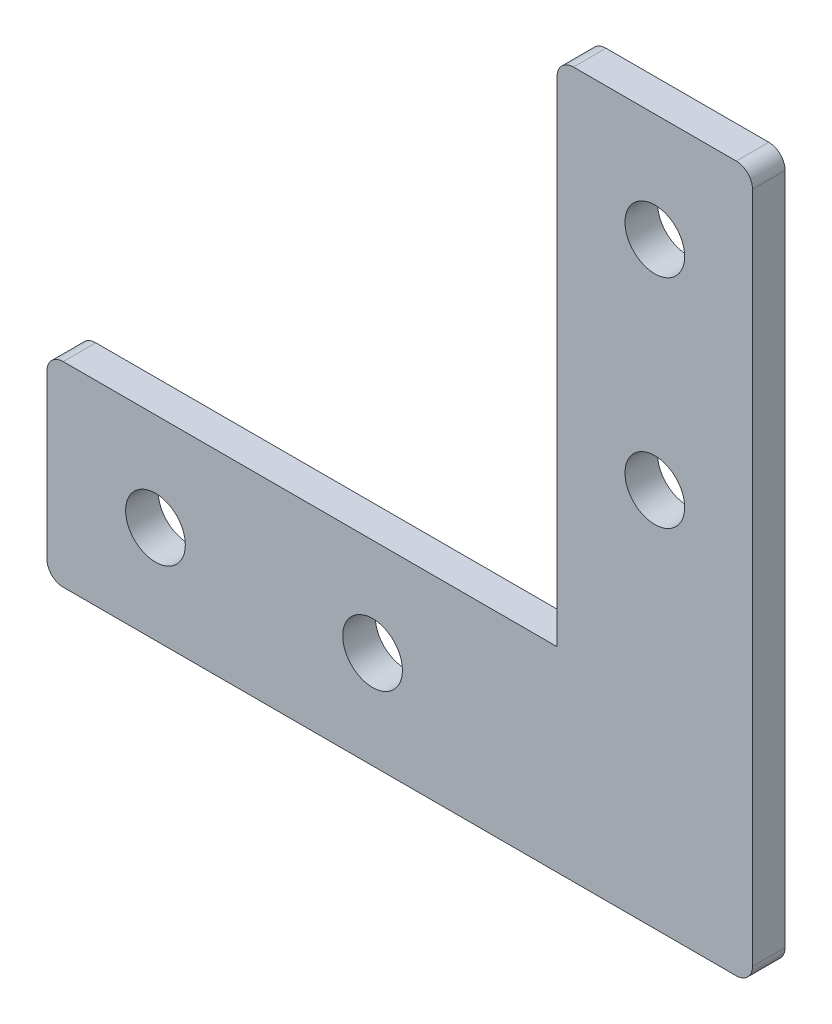
ISO-10303-21;
HEADER;
FILE_DESCRIPTION(('STEP AP214'),'2;1');
FILE_NAME('part.step','',(''),(''),'','','');
FILE_SCHEMA(('AUTOMOTIVE_DESIGN { 1 0 10303 214 1 1 1 1 }'));
ENDSEC;
DATA;
#1=APPLICATION_CONTEXT('core data for automotive mechanical design processes');
#2=APPLICATION_PROTOCOL_DEFINITION('international standard','automotive_design',2000,#1);
#3=PRODUCT_CONTEXT('',#1,'mechanical');
#4=PRODUCT('Part','Part','',(#3));
#5=PRODUCT_RELATED_PRODUCT_CATEGORY('part','',(#4));
#6=PRODUCT_DEFINITION_FORMATION('','',#4);
#7=PRODUCT_DEFINITION_CONTEXT('part definition',#1,'design');
#8=PRODUCT_DEFINITION('design','',#6,#7);
#9=PRODUCT_DEFINITION_SHAPE('','',#8);
#10=(LENGTH_UNIT() NAMED_UNIT(*) SI_UNIT(.MILLI.,.METRE.));
#11=(NAMED_UNIT(*) PLANE_ANGLE_UNIT() SI_UNIT($,.RADIAN.));
#12=(NAMED_UNIT(*) SI_UNIT($,.STERADIAN.) SOLID_ANGLE_UNIT());
#13=UNCERTAINTY_MEASURE_WITH_UNIT(LENGTH_MEASURE(1.E-05),#10,'distance_accuracy_value','');
#14=(GEOMETRIC_REPRESENTATION_CONTEXT(3) GLOBAL_UNCERTAINTY_ASSIGNED_CONTEXT((#13)) GLOBAL_UNIT_ASSIGNED_CONTEXT((#10,
#11,#12)) REPRESENTATION_CONTEXT('',''));
#15=CARTESIAN_POINT('',(0.,0.,0.));
#16=DIRECTION('',(0.,0.,1.));
#17=DIRECTION('',(1.,0.,0.));
#18=AXIS2_PLACEMENT_3D('',#15,#16,#17);
#19=CARTESIAN_POINT('',(1.5,16.5,0.));
#20=DIRECTION('',(0.,0.,1.));
#21=DIRECTION('',(1.,0.,0.));
#22=AXIS2_PLACEMENT_3D('',#19,#20,#21);
#23=PLANE('',#22);
#24=CARTESIAN_POINT('',(10.,9.,0.));
#25=DIRECTION('',(0.,0.,1.));
#26=DIRECTION('',(1.,0.,0.));
#27=AXIS2_PLACEMENT_3D('',#24,#25,#26);
#28=CIRCLE('',#27,2.75);
#29=CARTESIAN_POINT('',(12.75,9.,0.));
#30=VERTEX_POINT('',#29);
#31=EDGE_CURVE('E155',#30,#30,#28,.T.);
#32=ORIENTED_EDGE('',*,*,#31,.F.);
#33=EDGE_LOOP('',(#32));
#34=FACE_BOUND('',#33,.T.);
#35=CARTESIAN_POINT('',(30.,9.,0.));
#36=DIRECTION('',(0.,0.,1.));
#37=DIRECTION('',(1.,0.,0.));
#38=AXIS2_PLACEMENT_3D('',#35,#36,#37);
#39=CIRCLE('',#38,2.75);
#40=CARTESIAN_POINT('',(32.75,9.,0.));
#41=VERTEX_POINT('',#40);
#42=EDGE_CURVE('E167',#41,#41,#39,.T.);
#43=ORIENTED_EDGE('',*,*,#42,.F.);
#44=EDGE_LOOP('',(#43));
#45=FACE_BOUND('',#44,.T.);
#46=CARTESIAN_POINT('',(56.,35.,0.));
#47=DIRECTION('',(0.,0.,1.));
#48=DIRECTION('',(1.,0.,0.));
#49=AXIS2_PLACEMENT_3D('',#46,#47,#48);
#50=CIRCLE('',#49,2.75);
#51=CARTESIAN_POINT('',(58.75,35.,0.));
#52=VERTEX_POINT('',#51);
#53=EDGE_CURVE('E181',#52,#52,#50,.T.);
#54=ORIENTED_EDGE('',*,*,#53,.F.);
#55=EDGE_LOOP('',(#54));
#56=FACE_BOUND('',#55,.T.);
#57=CARTESIAN_POINT('',(56.,55.,0.));
#58=DIRECTION('',(0.,0.,1.));
#59=DIRECTION('',(1.,0.,0.));
#60=AXIS2_PLACEMENT_3D('',#57,#58,#59);
#61=CIRCLE('',#60,2.75);
#62=CARTESIAN_POINT('',(58.75,55.,0.));
#63=VERTEX_POINT('',#62);
#64=EDGE_CURVE('E198',#63,#63,#61,.T.);
#65=ORIENTED_EDGE('',*,*,#64,.F.);
#66=EDGE_LOOP('',(#65));
#67=FACE_BOUND('',#66,.T.);
#68=CARTESIAN_POINT('',(1.5,16.5,0.));
#69=DIRECTION('',(0.,0.,1.));
#70=DIRECTION('',(1.,0.,0.));
#71=AXIS2_PLACEMENT_3D('',#68,#69,#70);
#72=CIRCLE('',#71,1.5);
#73=CARTESIAN_POINT('',(1.5,18.,0.));
#74=VERTEX_POINT('',#73);
#75=CARTESIAN_POINT('',(0.,16.5,0.));
#76=VERTEX_POINT('',#75);
#77=EDGE_CURVE('E131',#74,#76,#72,.T.);
#78=ORIENTED_EDGE('',*,*,#77,.T.);
#79=DIRECTION('',(0.,-1.,0.));
#80=VECTOR('',#79,1.);
#81=CARTESIAN_POINT('',(0.,16.5,0.));
#82=LINE('',#81,#80);
#83=CARTESIAN_POINT('',(0.,1.5,0.));
#84=VERTEX_POINT('',#83);
#85=EDGE_CURVE('E27',#76,#84,#82,.T.);
#86=ORIENTED_EDGE('',*,*,#85,.T.);
#87=CARTESIAN_POINT('',(1.5,1.5,0.));
#88=DIRECTION('',(0.,0.,1.));
#89=DIRECTION('',(1.,0.,0.));
#90=AXIS2_PLACEMENT_3D('',#87,#88,#89);
#91=CIRCLE('',#90,1.5);
#92=CARTESIAN_POINT('',(1.5,0.,0.));
#93=VERTEX_POINT('',#92);
#94=EDGE_CURVE('E306',#84,#93,#91,.T.);
#95=ORIENTED_EDGE('',*,*,#94,.T.);
#96=DIRECTION('',(1.,0.,0.));
#97=VECTOR('',#96,1.);
#98=CARTESIAN_POINT('',(1.5,0.,0.));
#99=LINE('',#98,#97);
#100=CARTESIAN_POINT('',(63.5,0.,0.));
#101=VERTEX_POINT('',#100);
#102=EDGE_CURVE('E217',#93,#101,#99,.T.);
#103=ORIENTED_EDGE('',*,*,#102,.T.);
#104=CARTESIAN_POINT('',(63.5,1.5,0.));
#105=DIRECTION('',(0.,0.,1.));
#106=DIRECTION('',(1.,0.,0.));
#107=AXIS2_PLACEMENT_3D('',#104,#105,#106);
#108=CIRCLE('',#107,1.5);
#109=CARTESIAN_POINT('',(65.,1.5,0.));
#110=VERTEX_POINT('',#109);
#111=EDGE_CURVE('E246',#101,#110,#108,.T.);
#112=ORIENTED_EDGE('',*,*,#111,.T.);
#113=DIRECTION('',(0.,1.,0.));
#114=VECTOR('',#113,1.);
#115=CARTESIAN_POINT('',(65.,1.5,0.));
#116=LINE('',#115,#114);
#117=CARTESIAN_POINT('',(65.,63.5,0.));
#118=VERTEX_POINT('',#117);
#119=EDGE_CURVE('E231',#110,#118,#116,.T.);
#120=ORIENTED_EDGE('',*,*,#119,.T.);
#121=CARTESIAN_POINT('',(63.5,63.5,0.));
#122=DIRECTION('',(0.,0.,1.));
#123=DIRECTION('',(1.,0.,0.));
#124=AXIS2_PLACEMENT_3D('',#121,#122,#123);
#125=CIRCLE('',#124,1.5);
#126=CARTESIAN_POINT('',(63.5,65.,0.));
#127=VERTEX_POINT('',#126);
#128=EDGE_CURVE('E257',#118,#127,#125,.T.);
#129=ORIENTED_EDGE('',*,*,#128,.T.);
#130=DIRECTION('',(-1.,0.,0.));
#131=VECTOR('',#130,1.);
#132=CARTESIAN_POINT('',(63.5,65.,0.));
#133=LINE('',#132,#131);
#134=CARTESIAN_POINT('',(48.5,65.,0.));
#135=VERTEX_POINT('',#134);
#136=EDGE_CURVE('E264',#127,#135,#133,.T.);
#137=ORIENTED_EDGE('',*,*,#136,.T.);
#138=CARTESIAN_POINT('',(48.5,63.5,0.));
#139=DIRECTION('',(0.,0.,1.));
#140=DIRECTION('',(-1.,0.,0.));
#141=AXIS2_PLACEMENT_3D('',#138,#139,#140);
#142=CIRCLE('',#141,1.5);
#143=CARTESIAN_POINT('',(47.,63.5,0.));
#144=VERTEX_POINT('',#143);
#145=EDGE_CURVE('E297',#135,#144,#142,.T.);
#146=ORIENTED_EDGE('',*,*,#145,.T.);
#147=DIRECTION('',(0.,-1.,0.));
#148=VECTOR('',#147,1.);
#149=CARTESIAN_POINT('',(47.,63.5,0.));
#150=LINE('',#149,#148);
#151=CARTESIAN_POINT('',(47.,18.,0.));
#152=VERTEX_POINT('',#151);
#153=EDGE_CURVE('E133',#144,#152,#150,.T.);
#154=ORIENTED_EDGE('',*,*,#153,.T.);
#155=DIRECTION('',(-1.,0.,0.));
#156=VECTOR('',#155,1.);
#157=CARTESIAN_POINT('',(47.,18.,0.));
#158=LINE('',#157,#156);
#159=EDGE_CURVE('E128',#152,#74,#158,.T.);
#160=ORIENTED_EDGE('',*,*,#159,.T.);
#161=EDGE_LOOP('',(#78,#86,#95,#103,#112,#120,#129,#137,#146,#154,#160));
#162=FACE_BOUND('',#161,.T.);
#163=ADVANCED_FACE('F19',(#34,#45,#56,#67,#162),#23,.T.);
#164=CARTESIAN_POINT('',(1.5,16.5,-3.));
#165=DIRECTION('',(0.,0.,1.));
#166=DIRECTION('',(1.,0.,0.));
#167=AXIS2_PLACEMENT_3D('',#164,#165,#166);
#168=PLANE('',#167);
#169=CARTESIAN_POINT('',(10.,9.,-3.));
#170=DIRECTION('',(0.,0.,1.));
#171=DIRECTION('',(1.,0.,0.));
#172=AXIS2_PLACEMENT_3D('',#169,#170,#171);
#173=CIRCLE('',#172,2.75);
#174=CARTESIAN_POINT('',(12.75,9.,-3.));
#175=VERTEX_POINT('',#174);
#176=EDGE_CURVE('E163',#175,#175,#173,.T.);
#177=ORIENTED_EDGE('',*,*,#176,.T.);
#178=EDGE_LOOP('',(#177));
#179=FACE_BOUND('',#178,.T.);
#180=CARTESIAN_POINT('',(30.,9.,-3.));
#181=DIRECTION('',(0.,0.,1.));
#182=DIRECTION('',(1.,0.,0.));
#183=AXIS2_PLACEMENT_3D('',#180,#181,#182);
#184=CIRCLE('',#183,2.75);
#185=CARTESIAN_POINT('',(32.75,9.,-3.));
#186=VERTEX_POINT('',#185);
#187=EDGE_CURVE('E176',#186,#186,#184,.T.);
#188=ORIENTED_EDGE('',*,*,#187,.T.);
#189=EDGE_LOOP('',(#188));
#190=FACE_BOUND('',#189,.T.);
#191=CARTESIAN_POINT('',(56.,35.,-3.));
#192=DIRECTION('',(0.,0.,1.));
#193=DIRECTION('',(1.,0.,0.));
#194=AXIS2_PLACEMENT_3D('',#191,#192,#193);
#195=CIRCLE('',#194,2.75);
#196=CARTESIAN_POINT('',(58.75,35.,-3.));
#197=VERTEX_POINT('',#196);
#198=EDGE_CURVE('E193',#197,#197,#195,.T.);
#199=ORIENTED_EDGE('',*,*,#198,.T.);
#200=EDGE_LOOP('',(#199));
#201=FACE_BOUND('',#200,.T.);
#202=CARTESIAN_POINT('',(56.,55.,-3.));
#203=DIRECTION('',(0.,0.,1.));
#204=DIRECTION('',(1.,0.,0.));
#205=AXIS2_PLACEMENT_3D('',#202,#203,#204);
#206=CIRCLE('',#205,2.75);
#207=CARTESIAN_POINT('',(58.75,55.,-3.));
#208=VERTEX_POINT('',#207);
#209=EDGE_CURVE('E344',#208,#208,#206,.T.);
#210=ORIENTED_EDGE('',*,*,#209,.T.);
#211=EDGE_LOOP('',(#210));
#212=FACE_BOUND('',#211,.T.);
#213=CARTESIAN_POINT('',(1.5,16.5,-3.));
#214=DIRECTION('',(0.,0.,1.));
#215=DIRECTION('',(1.,0.,0.));
#216=AXIS2_PLACEMENT_3D('',#213,#214,#215);
#217=CIRCLE('',#216,1.5);
#218=CARTESIAN_POINT('',(1.5,18.,-3.));
#219=VERTEX_POINT('',#218);
#220=CARTESIAN_POINT('',(0.,16.5,-3.));
#221=VERTEX_POINT('',#220);
#222=EDGE_CURVE('E150',#219,#221,#217,.T.);
#223=ORIENTED_EDGE('',*,*,#222,.F.);
#224=DIRECTION('',(-1.,0.,0.));
#225=VECTOR('',#224,1.);
#226=CARTESIAN_POINT('',(47.,18.,-3.));
#227=LINE('',#226,#225);
#228=CARTESIAN_POINT('',(47.,18.,-3.));
#229=VERTEX_POINT('',#228);
#230=EDGE_CURVE('E145',#229,#219,#227,.T.);
#231=ORIENTED_EDGE('',*,*,#230,.F.);
#232=DIRECTION('',(0.,-1.,0.));
#233=VECTOR('',#232,1.);
#234=CARTESIAN_POINT('',(47.,63.5,-3.));
#235=LINE('',#234,#233);
#236=CARTESIAN_POINT('',(47.,63.5,-3.));
#237=VERTEX_POINT('',#236);
#238=EDGE_CURVE('E291',#237,#229,#235,.T.);
#239=ORIENTED_EDGE('',*,*,#238,.F.);
#240=CARTESIAN_POINT('',(48.5,63.5,-3.));
#241=DIRECTION('',(0.,0.,1.));
#242=DIRECTION('',(-1.,0.,0.));
#243=AXIS2_PLACEMENT_3D('',#240,#241,#242);
#244=CIRCLE('',#243,1.5);
#245=CARTESIAN_POINT('',(48.5,65.,-3.));
#246=VERTEX_POINT('',#245);
#247=EDGE_CURVE('E262',#246,#237,#244,.T.);
#248=ORIENTED_EDGE('',*,*,#247,.F.);
#249=DIRECTION('',(-1.,0.,0.));
#250=VECTOR('',#249,1.);
#251=CARTESIAN_POINT('',(63.5,65.,-3.));
#252=LINE('',#251,#250);
#253=CARTESIAN_POINT('',(63.5,65.,-3.));
#254=VERTEX_POINT('',#253);
#255=EDGE_CURVE('E261',#254,#246,#252,.T.);
#256=ORIENTED_EDGE('',*,*,#255,.F.);
#257=CARTESIAN_POINT('',(63.5,63.5,-3.));
#258=DIRECTION('',(0.,0.,1.));
#259=DIRECTION('',(1.,0.,0.));
#260=AXIS2_PLACEMENT_3D('',#257,#258,#259);
#261=CIRCLE('',#260,1.5);
#262=CARTESIAN_POINT('',(65.,63.5,-3.));
#263=VERTEX_POINT('',#262);
#264=EDGE_CURVE('E237',#263,#254,#261,.T.);
#265=ORIENTED_EDGE('',*,*,#264,.F.);
#266=DIRECTION('',(0.,1.,0.));
#267=VECTOR('',#266,1.);
#268=CARTESIAN_POINT('',(65.,1.5,-3.));
#269=LINE('',#268,#267);
#270=CARTESIAN_POINT('',(65.,1.5,-3.));
#271=VERTEX_POINT('',#270);
#272=EDGE_CURVE('E243',#271,#263,#269,.T.);
#273=ORIENTED_EDGE('',*,*,#272,.F.);
#274=CARTESIAN_POINT('',(63.5,1.5,-3.));
#275=DIRECTION('',(0.,0.,1.));
#276=DIRECTION('',(1.,0.,0.));
#277=AXIS2_PLACEMENT_3D('',#274,#275,#276);
#278=CIRCLE('',#277,1.5);
#279=CARTESIAN_POINT('',(63.5,0.,-3.));
#280=VERTEX_POINT('',#279);
#281=EDGE_CURVE('E222',#280,#271,#278,.T.);
#282=ORIENTED_EDGE('',*,*,#281,.F.);
#283=DIRECTION('',(1.,0.,0.));
#284=VECTOR('',#283,1.);
#285=CARTESIAN_POINT('',(1.5,0.,-3.));
#286=LINE('',#285,#284);
#287=CARTESIAN_POINT('',(1.5,0.,-3.));
#288=VERTEX_POINT('',#287);
#289=EDGE_CURVE('E414',#288,#280,#286,.T.);
#290=ORIENTED_EDGE('',*,*,#289,.F.);
#291=CARTESIAN_POINT('',(1.5,1.5,-3.));
#292=DIRECTION('',(0.,0.,1.));
#293=DIRECTION('',(1.,0.,0.));
#294=AXIS2_PLACEMENT_3D('',#291,#292,#293);
#295=CIRCLE('',#294,1.5);
#296=CARTESIAN_POINT('',(0.,1.5,-3.));
#297=VERTEX_POINT('',#296);
#298=EDGE_CURVE('E273',#297,#288,#295,.T.);
#299=ORIENTED_EDGE('',*,*,#298,.F.);
#300=DIRECTION('',(0.,-1.,0.));
#301=VECTOR('',#300,1.);
#302=CARTESIAN_POINT('',(0.,16.5,-3.));
#303=LINE('',#302,#301);
#304=EDGE_CURVE('E12',#221,#297,#303,.T.);
#305=ORIENTED_EDGE('',*,*,#304,.F.);
#306=EDGE_LOOP('',(#223,#231,#239,#248,#256,#265,#273,#282,#290,#299,#305));
#307=FACE_BOUND('',#306,.T.);
#308=ADVANCED_FACE('F290',(#179,#190,#201,#212,#307),#168,.F.);
#309=CARTESIAN_POINT('',(0.,16.5,-3.));
#310=DIRECTION('',(-1.,0.,0.));
#311=DIRECTION('',(0.,0.,1.));
#312=AXIS2_PLACEMENT_3D('',#309,#310,#311);
#313=PLANE('',#312);
#314=ORIENTED_EDGE('',*,*,#85,.F.);
#315=DIRECTION('',(0.,0.,1.));
#316=VECTOR('',#315,1.);
#317=CARTESIAN_POINT('',(0.,16.5,-3.));
#318=LINE('',#317,#316);
#319=EDGE_CURVE('E139',#221,#76,#318,.T.);
#320=ORIENTED_EDGE('',*,*,#319,.F.);
#321=ORIENTED_EDGE('',*,*,#304,.T.);
#322=DIRECTION('',(0.,0.,1.));
#323=VECTOR('',#322,1.);
#324=CARTESIAN_POINT('',(0.,1.5,-3.));
#325=LINE('',#324,#323);
#326=EDGE_CURVE('E304',#297,#84,#325,.T.);
#327=ORIENTED_EDGE('',*,*,#326,.T.);
#328=EDGE_LOOP('',(#314,#320,#321,#327));
#329=FACE_BOUND('',#328,.T.);
#330=ADVANCED_FACE('F330',(#329),#313,.T.);
#331=CARTESIAN_POINT('',(1.5,1.5,-3.));
#332=DIRECTION('',(0.,0.,1.));
#333=DIRECTION('',(1.,0.,0.));
#334=AXIS2_PLACEMENT_3D('',#331,#332,#333);
#335=CYLINDRICAL_SURFACE('',#334,1.5);
#336=ORIENTED_EDGE('',*,*,#94,.F.);
#337=ORIENTED_EDGE('',*,*,#326,.F.);
#338=ORIENTED_EDGE('',*,*,#298,.T.);
#339=DIRECTION('',(0.,0.,1.));
#340=VECTOR('',#339,1.);
#341=CARTESIAN_POINT('',(1.5,0.,-3.));
#342=LINE('',#341,#340);
#343=EDGE_CURVE('E221',#288,#93,#342,.T.);
#344=ORIENTED_EDGE('',*,*,#343,.T.);
#345=EDGE_LOOP('',(#336,#337,#338,#344));
#346=FACE_BOUND('',#345,.T.);
#347=ADVANCED_FACE('F393',(#346),#335,.T.);
#348=CARTESIAN_POINT('',(1.5,0.,-3.));
#349=DIRECTION('',(0.,-1.,0.));
#350=DIRECTION('',(0.,0.,-1.));
#351=AXIS2_PLACEMENT_3D('',#348,#349,#350);
#352=PLANE('',#351);
#353=ORIENTED_EDGE('',*,*,#102,.F.);
#354=ORIENTED_EDGE('',*,*,#343,.F.);
#355=ORIENTED_EDGE('',*,*,#289,.T.);
#356=DIRECTION('',(0.,0.,1.));
#357=VECTOR('',#356,1.);
#358=CARTESIAN_POINT('',(63.5,0.,-3.));
#359=LINE('',#358,#357);
#360=EDGE_CURVE('E250',#280,#101,#359,.T.);
#361=ORIENTED_EDGE('',*,*,#360,.T.);
#362=EDGE_LOOP('',(#353,#354,#355,#361));
#363=FACE_BOUND('',#362,.T.);
#364=ADVANCED_FACE('F390',(#363),#352,.T.);
#365=CARTESIAN_POINT('',(63.5,1.5,-3.));
#366=DIRECTION('',(0.,0.,1.));
#367=DIRECTION('',(1.,0.,0.));
#368=AXIS2_PLACEMENT_3D('',#365,#366,#367);
#369=CYLINDRICAL_SURFACE('',#368,1.5);
#370=ORIENTED_EDGE('',*,*,#111,.F.);
#371=ORIENTED_EDGE('',*,*,#360,.F.);
#372=ORIENTED_EDGE('',*,*,#281,.T.);
#373=DIRECTION('',(0.,0.,1.));
#374=VECTOR('',#373,1.);
#375=CARTESIAN_POINT('',(65.,1.5,-3.));
#376=LINE('',#375,#374);
#377=EDGE_CURVE('E236',#271,#110,#376,.T.);
#378=ORIENTED_EDGE('',*,*,#377,.T.);
#379=EDGE_LOOP('',(#370,#371,#372,#378));
#380=FACE_BOUND('',#379,.T.);
#381=ADVANCED_FACE('F366',(#380),#369,.T.);
#382=CARTESIAN_POINT('',(65.,1.5,-3.));
#383=DIRECTION('',(1.,0.,0.));
#384=DIRECTION('',(0.,1.,0.));
#385=AXIS2_PLACEMENT_3D('',#382,#383,#384);
#386=PLANE('',#385);
#387=ORIENTED_EDGE('',*,*,#119,.F.);
#388=ORIENTED_EDGE('',*,*,#377,.F.);
#389=ORIENTED_EDGE('',*,*,#272,.T.);
#390=DIRECTION('',(0.,0.,1.));
#391=VECTOR('',#390,1.);
#392=CARTESIAN_POINT('',(65.,63.5,-3.));
#393=LINE('',#392,#391);
#394=EDGE_CURVE('E238',#263,#118,#393,.T.);
#395=ORIENTED_EDGE('',*,*,#394,.T.);
#396=EDGE_LOOP('',(#387,#388,#389,#395));
#397=FACE_BOUND('',#396,.T.);
#398=ADVANCED_FACE('F397',(#397),#386,.T.);
#399=CARTESIAN_POINT('',(63.5,63.5,-3.));
#400=DIRECTION('',(0.,0.,1.));
#401=DIRECTION('',(1.,0.,0.));
#402=AXIS2_PLACEMENT_3D('',#399,#400,#401);
#403=CYLINDRICAL_SURFACE('',#402,1.5);
#404=ORIENTED_EDGE('',*,*,#128,.F.);
#405=ORIENTED_EDGE('',*,*,#394,.F.);
#406=ORIENTED_EDGE('',*,*,#264,.T.);
#407=DIRECTION('',(0.,0.,1.));
#408=VECTOR('',#407,1.);
#409=CARTESIAN_POINT('',(63.5,65.,-3.));
#410=LINE('',#409,#408);
#411=EDGE_CURVE('E268',#254,#127,#410,.T.);
#412=ORIENTED_EDGE('',*,*,#411,.T.);
#413=EDGE_LOOP('',(#404,#405,#406,#412));
#414=FACE_BOUND('',#413,.T.);
#415=ADVANCED_FACE('F369',(#414),#403,.T.);
#416=CARTESIAN_POINT('',(63.5,65.,-3.));
#417=DIRECTION('',(0.,1.,0.));
#418=DIRECTION('',(1.,0.,0.));
#419=AXIS2_PLACEMENT_3D('',#416,#417,#418);
#420=PLANE('',#419);
#421=ORIENTED_EDGE('',*,*,#136,.F.);
#422=ORIENTED_EDGE('',*,*,#411,.F.);
#423=ORIENTED_EDGE('',*,*,#255,.T.);
#424=DIRECTION('',(0.,0.,1.));
#425=VECTOR('',#424,1.);
#426=CARTESIAN_POINT('',(48.5,65.,-3.));
#427=LINE('',#426,#425);
#428=EDGE_CURVE('E285',#246,#135,#427,.T.);
#429=ORIENTED_EDGE('',*,*,#428,.T.);
#430=EDGE_LOOP('',(#421,#422,#423,#429));
#431=FACE_BOUND('',#430,.T.);
#432=ADVANCED_FACE('F283',(#431),#420,.T.);
#433=CARTESIAN_POINT('',(48.5,63.5,-3.));
#434=DIRECTION('',(0.,0.,1.));
#435=DIRECTION('',(1.,0.,0.));
#436=AXIS2_PLACEMENT_3D('',#433,#434,#435);
#437=CYLINDRICAL_SURFACE('',#436,1.5);
#438=ORIENTED_EDGE('',*,*,#145,.F.);
#439=ORIENTED_EDGE('',*,*,#428,.F.);
#440=ORIENTED_EDGE('',*,*,#247,.T.);
#441=DIRECTION('',(0.,0.,1.));
#442=VECTOR('',#441,1.);
#443=CARTESIAN_POINT('',(47.,63.5,-3.));
#444=LINE('',#443,#442);
#445=EDGE_CURVE('E212',#237,#144,#444,.T.);
#446=ORIENTED_EDGE('',*,*,#445,.T.);
#447=EDGE_LOOP('',(#438,#439,#440,#446));
#448=FACE_BOUND('',#447,.T.);
#449=ADVANCED_FACE('F296',(#448),#437,.T.);
#450=CARTESIAN_POINT('',(47.,63.5,-3.));
#451=DIRECTION('',(-1.,0.,0.));
#452=DIRECTION('',(0.,0.,1.));
#453=AXIS2_PLACEMENT_3D('',#450,#451,#452);
#454=PLANE('',#453);
#455=ORIENTED_EDGE('',*,*,#153,.F.);
#456=ORIENTED_EDGE('',*,*,#445,.F.);
#457=ORIENTED_EDGE('',*,*,#238,.T.);
#458=DIRECTION('',(0.,0.,1.));
#459=VECTOR('',#458,1.);
#460=CARTESIAN_POINT('',(47.,18.,-3.));
#461=LINE('',#460,#459);
#462=EDGE_CURVE('E138',#229,#152,#461,.T.);
#463=ORIENTED_EDGE('',*,*,#462,.T.);
#464=EDGE_LOOP('',(#455,#456,#457,#463));
#465=FACE_BOUND('',#464,.T.);
#466=ADVANCED_FACE('F313',(#465),#454,.T.);
#467=CARTESIAN_POINT('',(47.,18.,-3.));
#468=DIRECTION('',(0.,1.,0.));
#469=DIRECTION('',(1.,0.,0.));
#470=AXIS2_PLACEMENT_3D('',#467,#468,#469);
#471=PLANE('',#470);
#472=ORIENTED_EDGE('',*,*,#159,.F.);
#473=ORIENTED_EDGE('',*,*,#462,.F.);
#474=ORIENTED_EDGE('',*,*,#230,.T.);
#475=DIRECTION('',(0.,0.,1.));
#476=VECTOR('',#475,1.);
#477=CARTESIAN_POINT('',(1.5,18.,-3.));
#478=LINE('',#477,#476);
#479=EDGE_CURVE('E142',#219,#74,#478,.T.);
#480=ORIENTED_EDGE('',*,*,#479,.T.);
#481=EDGE_LOOP('',(#472,#473,#474,#480));
#482=FACE_BOUND('',#481,.T.);
#483=ADVANCED_FACE('F143',(#482),#471,.T.);
#484=CARTESIAN_POINT('',(1.5,16.5,-3.));
#485=DIRECTION('',(0.,0.,1.));
#486=DIRECTION('',(1.,0.,0.));
#487=AXIS2_PLACEMENT_3D('',#484,#485,#486);
#488=CYLINDRICAL_SURFACE('',#487,1.5);
#489=ORIENTED_EDGE('',*,*,#77,.F.);
#490=ORIENTED_EDGE('',*,*,#479,.F.);
#491=ORIENTED_EDGE('',*,*,#222,.T.);
#492=ORIENTED_EDGE('',*,*,#319,.T.);
#493=EDGE_LOOP('',(#489,#490,#491,#492));
#494=FACE_BOUND('',#493,.T.);
#495=ADVANCED_FACE('F153',(#494),#488,.T.);
#496=CARTESIAN_POINT('',(10.,9.,-3.));
#497=DIRECTION('',(0.,0.,1.));
#498=DIRECTION('',(1.,0.,0.));
#499=AXIS2_PLACEMENT_3D('',#496,#497,#498);
#500=CYLINDRICAL_SURFACE('',#499,2.75);
#501=ORIENTED_EDGE('',*,*,#31,.T.);
#502=EDGE_LOOP('',(#501));
#503=FACE_BOUND('',#502,.T.);
#504=ORIENTED_EDGE('',*,*,#176,.F.);
#505=EDGE_LOOP('',(#504));
#506=FACE_BOUND('',#505,.T.);
#507=ADVANCED_FACE('F370',(#503,#506),#500,.F.);
#508=CARTESIAN_POINT('',(30.,9.,-3.));
#509=DIRECTION('',(0.,0.,1.));
#510=DIRECTION('',(1.,0.,0.));
#511=AXIS2_PLACEMENT_3D('',#508,#509,#510);
#512=CYLINDRICAL_SURFACE('',#511,2.75);
#513=ORIENTED_EDGE('',*,*,#42,.T.);
#514=EDGE_LOOP('',(#513));
#515=FACE_BOUND('',#514,.T.);
#516=ORIENTED_EDGE('',*,*,#187,.F.);
#517=EDGE_LOOP('',(#516));
#518=FACE_BOUND('',#517,.T.);
#519=ADVANCED_FACE('F362',(#515,#518),#512,.F.);
#520=CARTESIAN_POINT('',(56.,35.,-3.));
#521=DIRECTION('',(0.,0.,1.));
#522=DIRECTION('',(1.,0.,0.));
#523=AXIS2_PLACEMENT_3D('',#520,#521,#522);
#524=CYLINDRICAL_SURFACE('',#523,2.75);
#525=ORIENTED_EDGE('',*,*,#53,.T.);
#526=EDGE_LOOP('',(#525));
#527=FACE_BOUND('',#526,.T.);
#528=ORIENTED_EDGE('',*,*,#198,.F.);
#529=EDGE_LOOP('',(#528));
#530=FACE_BOUND('',#529,.T.);
#531=ADVANCED_FACE('F357',(#527,#530),#524,.F.);
#532=CARTESIAN_POINT('',(56.,55.,-3.));
#533=DIRECTION('',(0.,0.,1.));
#534=DIRECTION('',(1.,0.,0.));
#535=AXIS2_PLACEMENT_3D('',#532,#533,#534);
#536=CYLINDRICAL_SURFACE('',#535,2.75);
#537=ORIENTED_EDGE('',*,*,#64,.T.);
#538=EDGE_LOOP('',(#537));
#539=FACE_BOUND('',#538,.T.);
#540=ORIENTED_EDGE('',*,*,#209,.F.);
#541=EDGE_LOOP('',(#540));
#542=FACE_BOUND('',#541,.T.);
#543=ADVANCED_FACE('F355',(#539,#542),#536,.F.);
#544=CLOSED_SHELL('',(#163,#308,#330,#347,#364,#381,#398,#415,#432,#449,#466,#483,#495,#507,
#519,#531,#543));
#545=MANIFOLD_SOLID_BREP('B1',#544);
#546=ADVANCED_BREP_SHAPE_REPRESENTATION('',(#18,#545),#14);
#547=SHAPE_DEFINITION_REPRESENTATION(#9,#546);
ENDSEC;
END-ISO-10303-21;
